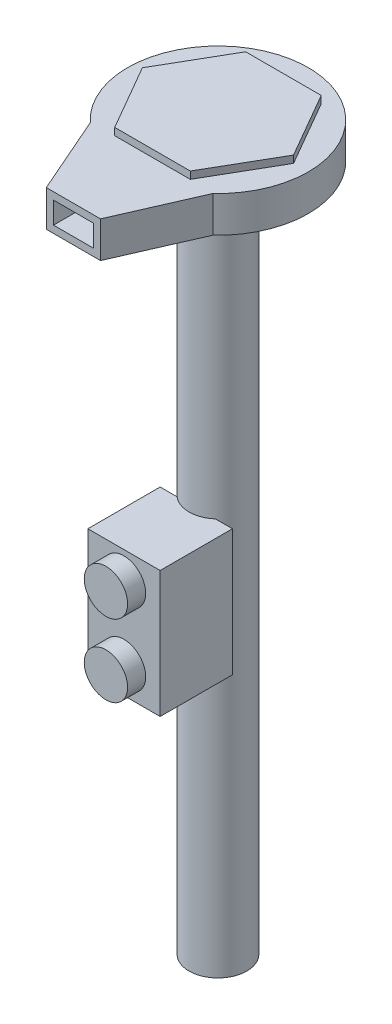
ISO-10303-21;
HEADER;
FILE_DESCRIPTION(('STEP AP214'),'2;1');
FILE_NAME('part.step','',(''),(''),'','','');
FILE_SCHEMA(('AUTOMOTIVE_DESIGN { 1 0 10303 214 1 1 1 1 }'));
ENDSEC;
DATA;
#1=APPLICATION_CONTEXT('core data for automotive mechanical design processes');
#2=APPLICATION_PROTOCOL_DEFINITION('international standard','automotive_design',2000,#1);
#3=PRODUCT_CONTEXT('',#1,'mechanical');
#4=PRODUCT('Part','Part','',(#3));
#5=PRODUCT_RELATED_PRODUCT_CATEGORY('part','',(#4));
#6=PRODUCT_DEFINITION_FORMATION('','',#4);
#7=PRODUCT_DEFINITION_CONTEXT('part definition',#1,'design');
#8=PRODUCT_DEFINITION('design','',#6,#7);
#9=PRODUCT_DEFINITION_SHAPE('','',#8);
#10=(LENGTH_UNIT() NAMED_UNIT(*) SI_UNIT(.MILLI.,.METRE.));
#11=(NAMED_UNIT(*) PLANE_ANGLE_UNIT() SI_UNIT($,.RADIAN.));
#12=(NAMED_UNIT(*) SI_UNIT($,.STERADIAN.) SOLID_ANGLE_UNIT());
#13=UNCERTAINTY_MEASURE_WITH_UNIT(LENGTH_MEASURE(1.E-05),#10,'distance_accuracy_value','');
#14=(GEOMETRIC_REPRESENTATION_CONTEXT(3) GLOBAL_UNCERTAINTY_ASSIGNED_CONTEXT((#13)) GLOBAL_UNIT_ASSIGNED_CONTEXT((#10,
#11,#12)) REPRESENTATION_CONTEXT('',''));
#15=CARTESIAN_POINT('',(0.,0.,0.));
#16=DIRECTION('',(0.,0.,1.));
#17=DIRECTION('',(1.,0.,0.));
#18=AXIS2_PLACEMENT_3D('',#15,#16,#17);
#19=CARTESIAN_POINT('',(-2.75000000000001,99.,-2.5));
#20=DIRECTION('',(-1.,0.,0.));
#21=DIRECTION('',(0.,-1.,0.));
#22=AXIS2_PLACEMENT_3D('',#19,#20,#21);
#23=PLANE('',#22);
#24=DIRECTION('',(0.,0.,1.));
#25=VECTOR('',#24,1.);
#26=CARTESIAN_POINT('',(-2.75000000000001,96.,-2.5));
#27=LINE('',#26,#25);
#28=CARTESIAN_POINT('',(-2.75000000000001,96.,1.19895788082816));
#29=VERTEX_POINT('',#28);
#30=CARTESIAN_POINT('',(-2.75000000000001,96.,20.));
#31=VERTEX_POINT('',#30);
#32=EDGE_CURVE('E413',#29,#31,#27,.T.);
#33=ORIENTED_EDGE('',*,*,#32,.F.);
#34=DIRECTION('',(0.,1.,0.));
#35=VECTOR('',#34,1.);
#36=CARTESIAN_POINT('',(-2.75,0.,1.19895788082819));
#37=LINE('',#36,#35);
#38=CARTESIAN_POINT('',(-2.75000000000001,99.,1.19895788082815));
#39=VERTEX_POINT('',#38);
#40=EDGE_CURVE('E389',#29,#39,#37,.T.);
#41=ORIENTED_EDGE('',*,*,#40,.T.);
#42=DIRECTION('',(0.,0.,1.));
#43=VECTOR('',#42,1.);
#44=CARTESIAN_POINT('',(-2.75000000000001,99.,-2.5));
#45=LINE('',#44,#43);
#46=CARTESIAN_POINT('',(-2.75000000000001,99.,20.));
#47=VERTEX_POINT('',#46);
#48=EDGE_CURVE('E433',#39,#47,#45,.T.);
#49=ORIENTED_EDGE('',*,*,#48,.T.);
#50=DIRECTION('',(0.,-1.,0.));
#51=VECTOR('',#50,1.);
#52=CARTESIAN_POINT('',(-2.75000000000001,99.,20.));
#53=LINE('',#52,#51);
#54=EDGE_CURVE('E393',#47,#31,#53,.T.);
#55=ORIENTED_EDGE('',*,*,#54,.T.);
#56=EDGE_LOOP('',(#33,#41,#49,#55));
#57=FACE_BOUND('',#56,.T.);
#58=ADVANCED_FACE('F49',(#57),#23,.F.);
#59=CARTESIAN_POINT('',(-2.75000000000001,96.,-2.5));
#60=DIRECTION('',(0.,-1.,0.));
#61=DIRECTION('',(0.,0.,-1.));
#62=AXIS2_PLACEMENT_3D('',#59,#60,#61);
#63=PLANE('',#62);
#64=DIRECTION('',(0.,0.,1.));
#65=VECTOR('',#64,1.);
#66=CARTESIAN_POINT('',(2.74999999999999,96.,-2.5));
#67=LINE('',#66,#65);
#68=CARTESIAN_POINT('',(2.74999999999999,96.,1.19895788082821));
#69=VERTEX_POINT('',#68);
#70=CARTESIAN_POINT('',(2.74999999999999,96.,20.));
#71=VERTEX_POINT('',#70);
#72=EDGE_CURVE('E443',#69,#71,#67,.T.);
#73=ORIENTED_EDGE('',*,*,#72,.F.);
#74=CARTESIAN_POINT('',(0.,96.,0.));
#75=DIRECTION('',(0.,-1.,0.));
#76=DIRECTION('',(0.,0.,-1.));
#77=AXIS2_PLACEMENT_3D('',#74,#75,#76);
#78=CIRCLE('',#77,3.);
#79=EDGE_CURVE('E370',#69,#29,#78,.T.);
#80=ORIENTED_EDGE('',*,*,#79,.T.);
#81=ORIENTED_EDGE('',*,*,#32,.T.);
#82=DIRECTION('',(1.,0.,0.));
#83=VECTOR('',#82,1.);
#84=CARTESIAN_POINT('',(-2.75000000000001,96.,20.));
#85=LINE('',#84,#83);
#86=EDGE_CURVE('E417',#31,#71,#85,.T.);
#87=ORIENTED_EDGE('',*,*,#86,.T.);
#88=EDGE_LOOP('',(#73,#80,#81,#87));
#89=FACE_BOUND('',#88,.T.);
#90=ADVANCED_FACE('F588',(#89),#63,.F.);
#91=CARTESIAN_POINT('',(0.,95.,0.));
#92=DIRECTION('',(0.,1.,0.));
#93=DIRECTION('',(0.,0.,1.));
#94=AXIS2_PLACEMENT_3D('',#91,#92,#93);
#95=CYLINDRICAL_SURFACE('',#94,12.5);
#96=CARTESIAN_POINT('',(0.,100.,0.));
#97=DIRECTION('',(0.,1.,0.));
#98=DIRECTION('',(0.,0.,1.));
#99=AXIS2_PLACEMENT_3D('',#96,#97,#98);
#100=CIRCLE('',#99,12.5);
#101=CARTESIAN_POINT('',(8.48360655737704,100.,9.18032786885246));
#102=VERTEX_POINT('',#101);
#103=CARTESIAN_POINT('',(-8.48360655737706,100.,9.18032786885245));
#104=VERTEX_POINT('',#103);
#105=EDGE_CURVE('E645',#102,#104,#100,.T.);
#106=ORIENTED_EDGE('',*,*,#105,.F.);
#107=DIRECTION('',(0.,1.,0.));
#108=VECTOR('',#107,1.);
#109=CARTESIAN_POINT('',(8.48360655737705,95.,9.18032786885246));
#110=LINE('',#109,#108);
#111=CARTESIAN_POINT('',(8.48360655737705,95.,9.18032786885246));
#112=VERTEX_POINT('',#111);
#113=EDGE_CURVE('E467',#102,#112,#110,.F.);
#114=ORIENTED_EDGE('',*,*,#113,.T.);
#115=CARTESIAN_POINT('',(0.,95.,0.));
#116=DIRECTION('',(0.,1.,0.));
#117=DIRECTION('',(0.,0.,1.));
#118=AXIS2_PLACEMENT_3D('',#115,#116,#117);
#119=CIRCLE('',#118,12.5);
#120=CARTESIAN_POINT('',(-8.48360655737706,95.,9.18032786885245));
#121=VERTEX_POINT('',#120);
#122=EDGE_CURVE('E635',#112,#121,#119,.T.);
#123=ORIENTED_EDGE('',*,*,#122,.T.);
#124=DIRECTION('',(0.,1.,0.));
#125=VECTOR('',#124,1.);
#126=CARTESIAN_POINT('',(-8.48360655737705,95.,9.18032786885245));
#127=LINE('',#126,#125);
#128=EDGE_CURVE('E649',#121,#104,#127,.T.);
#129=ORIENTED_EDGE('',*,*,#128,.T.);
#130=EDGE_LOOP('',(#106,#114,#123,#129));
#131=FACE_BOUND('',#130,.T.);
#132=ADVANCED_FACE('F593',(#131),#95,.T.);
#133=CARTESIAN_POINT('',(0.,100.,0.));
#134=DIRECTION('',(0.,-1.,0.));
#135=DIRECTION('',(0.,0.,-1.));
#136=AXIS2_PLACEMENT_3D('',#133,#134,#135);
#137=CYLINDRICAL_SURFACE('',#136,4.);
#138=CARTESIAN_POINT('',(0.,55.,0.));
#139=DIRECTION('',(0.,1.,0.));
#140=DIRECTION('',(0.,0.,1.));
#141=AXIS2_PLACEMENT_3D('',#138,#139,#140);
#142=CIRCLE('',#141,4.);
#143=CARTESIAN_POINT('',(-2.64575131106459,55.,3.));
#144=VERTEX_POINT('',#143);
#145=CARTESIAN_POINT('',(2.64575131106459,55.,3.));
#146=VERTEX_POINT('',#145);
#147=EDGE_CURVE('E293',#144,#146,#142,.T.);
#148=ORIENTED_EDGE('',*,*,#147,.T.);
#149=DIRECTION('',(0.,-1.,0.));
#150=VECTOR('',#149,1.);
#151=CARTESIAN_POINT('',(2.64575131106459,100.,3.));
#152=LINE('',#151,#150);
#153=CARTESIAN_POINT('',(2.64575131106459,37.5,3.));
#154=VERTEX_POINT('',#153);
#155=EDGE_CURVE('E286',#146,#154,#152,.T.);
#156=ORIENTED_EDGE('',*,*,#155,.T.);
#157=CARTESIAN_POINT('',(0.,37.5,0.));
#158=DIRECTION('',(0.,1.,0.));
#159=DIRECTION('',(0.,0.,1.));
#160=AXIS2_PLACEMENT_3D('',#157,#158,#159);
#161=CIRCLE('',#160,4.);
#162=CARTESIAN_POINT('',(-2.64575131106459,37.5,3.));
#163=VERTEX_POINT('',#162);
#164=EDGE_CURVE('E290',#163,#154,#161,.T.);
#165=ORIENTED_EDGE('',*,*,#164,.F.);
#166=DIRECTION('',(0.,-1.,0.));
#167=VECTOR('',#166,1.);
#168=CARTESIAN_POINT('',(-2.64575131106459,100.,3.));
#169=LINE('',#168,#167);
#170=EDGE_CURVE('E276',#163,#144,#169,.F.);
#171=ORIENTED_EDGE('',*,*,#170,.T.);
#172=EDGE_LOOP('',(#148,#156,#165,#171));
#173=FACE_BOUND('',#172,.T.);
#174=CARTESIAN_POINT('',(0.,0.,0.));
#175=DIRECTION('',(0.,1.,0.));
#176=DIRECTION('',(0.,0.,1.));
#177=AXIS2_PLACEMENT_3D('',#174,#175,#176);
#178=CIRCLE('',#177,4.);
#179=CARTESIAN_POINT('',(0.,0.,4.));
#180=VERTEX_POINT('',#179);
#181=EDGE_CURVE('E627',#180,#180,#178,.T.);
#182=ORIENTED_EDGE('',*,*,#181,.T.);
#183=EDGE_LOOP('',(#182));
#184=FACE_BOUND('',#183,.T.);
#185=CARTESIAN_POINT('',(0.,95.,0.));
#186=DIRECTION('',(0.,1.,0.));
#187=DIRECTION('',(0.,0.,1.));
#188=AXIS2_PLACEMENT_3D('',#185,#186,#187);
#189=CIRCLE('',#188,4.);
#190=CARTESIAN_POINT('',(0.,95.,4.));
#191=VERTEX_POINT('',#190);
#192=EDGE_CURVE('E623',#191,#191,#189,.T.);
#193=ORIENTED_EDGE('',*,*,#192,.F.);
#194=EDGE_LOOP('',(#193));
#195=FACE_BOUND('',#194,.T.);
#196=ADVANCED_FACE('F51',(#173,#184,#195),#137,.T.);
#197=CARTESIAN_POINT('',(0.,0.,0.));
#198=DIRECTION('',(0.,1.,0.));
#199=DIRECTION('',(0.,0.,1.));
#200=AXIS2_PLACEMENT_3D('',#197,#198,#199);
#201=CYLINDRICAL_SURFACE('',#200,3.);
#202=CARTESIAN_POINT('',(0.,0.,0.));
#203=DIRECTION('',(0.,1.,0.));
#204=DIRECTION('',(0.,0.,1.));
#205=AXIS2_PLACEMENT_3D('',#202,#203,#204);
#206=CIRCLE('',#205,3.);
#207=CARTESIAN_POINT('',(0.,0.,3.));
#208=VERTEX_POINT('',#207);
#209=EDGE_CURVE('E632',#208,#208,#206,.T.);
#210=ORIENTED_EDGE('',*,*,#209,.F.);
#211=EDGE_LOOP('',(#210));
#212=FACE_BOUND('',#211,.T.);
#213=ORIENTED_EDGE('',*,*,#79,.F.);
#214=DIRECTION('',(0.,1.,0.));
#215=VECTOR('',#214,1.);
#216=CARTESIAN_POINT('',(2.75,0.,1.19895788082818));
#217=LINE('',#216,#215);
#218=CARTESIAN_POINT('',(2.75,99.,1.19895788082818));
#219=VERTEX_POINT('',#218);
#220=EDGE_CURVE('E385',#219,#69,#217,.F.);
#221=ORIENTED_EDGE('',*,*,#220,.F.);
#222=CARTESIAN_POINT('',(0.,99.,0.));
#223=DIRECTION('',(0.,1.,0.));
#224=DIRECTION('',(0.,0.,1.));
#225=AXIS2_PLACEMENT_3D('',#222,#223,#224);
#226=CIRCLE('',#225,3.);
#227=EDGE_CURVE('E376',#39,#219,#226,.T.);
#228=ORIENTED_EDGE('',*,*,#227,.F.);
#229=ORIENTED_EDGE('',*,*,#40,.F.);
#230=EDGE_LOOP('',(#213,#221,#228,#229));
#231=FACE_BOUND('',#230,.T.);
#232=DIRECTION('',(0.,1.,0.));
#233=VECTOR('',#232,1.);
#234=CARTESIAN_POINT('',(2.75,0.,-1.19895788082818));
#235=LINE('',#234,#233);
#236=CARTESIAN_POINT('',(2.74999999999999,96.,-1.19895788082821));
#237=VERTEX_POINT('',#236);
#238=CARTESIAN_POINT('',(2.75,99.,-1.19895788082818));
#239=VERTEX_POINT('',#238);
#240=EDGE_CURVE('E381',#237,#239,#235,.T.);
#241=ORIENTED_EDGE('',*,*,#240,.F.);
#242=CARTESIAN_POINT('',(1.6583123951777,96.,-2.5));
#243=VERTEX_POINT('',#242);
#244=EDGE_CURVE('E371',#243,#237,#78,.T.);
#245=ORIENTED_EDGE('',*,*,#244,.F.);
#246=DIRECTION('',(0.,1.,0.));
#247=VECTOR('',#246,1.);
#248=CARTESIAN_POINT('',(1.6583123951777,0.,-2.5));
#249=LINE('',#248,#247);
#250=CARTESIAN_POINT('',(1.6583123951777,99.,-2.5));
#251=VERTEX_POINT('',#250);
#252=EDGE_CURVE('E622',#243,#251,#249,.T.);
#253=ORIENTED_EDGE('',*,*,#252,.T.);
#254=EDGE_CURVE('E377',#239,#251,#226,.T.);
#255=ORIENTED_EDGE('',*,*,#254,.F.);
#256=EDGE_LOOP('',(#241,#245,#253,#255));
#257=FACE_BOUND('',#256,.T.);
#258=CARTESIAN_POINT('',(-1.6583123951777,99.,-2.5));
#259=VERTEX_POINT('',#258);
#260=CARTESIAN_POINT('',(-2.75000000000001,99.,-1.19895788082815));
#261=VERTEX_POINT('',#260);
#262=EDGE_CURVE('E369',#259,#261,#226,.T.);
#263=ORIENTED_EDGE('',*,*,#262,.F.);
#264=DIRECTION('',(0.,1.,0.));
#265=VECTOR('',#264,1.);
#266=CARTESIAN_POINT('',(-1.6583123951777,0.,-2.5));
#267=LINE('',#266,#265);
#268=CARTESIAN_POINT('',(-1.6583123951777,96.,-2.5));
#269=VERTEX_POINT('',#268);
#270=EDGE_CURVE('E562',#259,#269,#267,.F.);
#271=ORIENTED_EDGE('',*,*,#270,.T.);
#272=CARTESIAN_POINT('',(-2.75000000000001,96.,-1.19895788082816));
#273=VERTEX_POINT('',#272);
#274=EDGE_CURVE('E365',#273,#269,#78,.T.);
#275=ORIENTED_EDGE('',*,*,#274,.F.);
#276=DIRECTION('',(0.,1.,0.));
#277=VECTOR('',#276,1.);
#278=CARTESIAN_POINT('',(-2.75,0.,-1.19895788082819));
#279=LINE('',#278,#277);
#280=EDGE_CURVE('E375',#261,#273,#279,.F.);
#281=ORIENTED_EDGE('',*,*,#280,.F.);
#282=EDGE_LOOP('',(#263,#271,#275,#281));
#283=FACE_BOUND('',#282,.T.);
#284=CARTESIAN_POINT('',(0.,100.,0.));
#285=DIRECTION('',(0.,1.,0.));
#286=DIRECTION('',(0.,0.,1.));
#287=AXIS2_PLACEMENT_3D('',#284,#285,#286);
#288=CIRCLE('',#287,3.);
#289=CARTESIAN_POINT('',(0.,100.,3.));
#290=VERTEX_POINT('',#289);
#291=EDGE_CURVE('E361',#290,#290,#288,.T.);
#292=ORIENTED_EDGE('',*,*,#291,.T.);
#293=EDGE_LOOP('',(#292));
#294=FACE_BOUND('',#293,.T.);
#295=ADVANCED_FACE('F573',(#212,#231,#257,#283,#294),#201,.F.);
#296=CARTESIAN_POINT('',(0.,0.,0.));
#297=DIRECTION('',(0.,1.,0.));
#298=DIRECTION('',(0.,0.,1.));
#299=AXIS2_PLACEMENT_3D('',#296,#297,#298);
#300=PLANE('',#299);
#301=ORIENTED_EDGE('',*,*,#209,.T.);
#302=EDGE_LOOP('',(#301));
#303=FACE_BOUND('',#302,.T.);
#304=ORIENTED_EDGE('',*,*,#181,.F.);
#305=EDGE_LOOP('',(#304));
#306=FACE_BOUND('',#305,.T.);
#307=ADVANCED_FACE('F575',(#303,#306),#300,.F.);
#308=CARTESIAN_POINT('',(0.,95.,0.));
#309=DIRECTION('',(0.,1.,0.));
#310=DIRECTION('',(0.,0.,1.));
#311=AXIS2_PLACEMENT_3D('',#308,#309,#310);
#312=PLANE('',#311);
#313=ORIENTED_EDGE('',*,*,#192,.T.);
#314=EDGE_LOOP('',(#313));
#315=FACE_BOUND('',#314,.T.);
#316=DIRECTION('',(0.400818834019707,0.,0.916157334902189));
#317=VECTOR('',#316,1.);
#318=CARTESIAN_POINT('',(-12.5,95.,0.));
#319=LINE('',#318,#317);
#320=CARTESIAN_POINT('',(-3.75000000000001,95.,20.));
#321=VERTEX_POINT('',#320);
#322=EDGE_CURVE('E432',#121,#321,#319,.T.);
#323=ORIENTED_EDGE('',*,*,#322,.F.);
#324=ORIENTED_EDGE('',*,*,#122,.F.);
#325=DIRECTION('',(-0.400818834019708,0.,0.916157334902189));
#326=VECTOR('',#325,1.);
#327=CARTESIAN_POINT('',(12.5,95.,0.));
#328=LINE('',#327,#326);
#329=CARTESIAN_POINT('',(3.74999999999999,95.,20.));
#330=VERTEX_POINT('',#329);
#331=EDGE_CURVE('E458',#112,#330,#328,.T.);
#332=ORIENTED_EDGE('',*,*,#331,.T.);
#333=DIRECTION('',(1.,0.,0.));
#334=VECTOR('',#333,1.);
#335=CARTESIAN_POINT('',(-3.75000000000001,95.,20.));
#336=LINE('',#335,#334);
#337=EDGE_CURVE('E522',#321,#330,#336,.T.);
#338=ORIENTED_EDGE('',*,*,#337,.F.);
#339=EDGE_LOOP('',(#323,#324,#332,#338));
#340=FACE_BOUND('',#339,.T.);
#341=ADVANCED_FACE('F572',(#315,#340),#312,.F.);
#342=CARTESIAN_POINT('',(0.,100.,0.));
#343=DIRECTION('',(0.,1.,0.));
#344=DIRECTION('',(0.,0.,1.));
#345=AXIS2_PLACEMENT_3D('',#342,#343,#344);
#346=PLANE('',#345);
#347=DIRECTION('',(0.499999999999995,0.,-0.866025403784441));
#348=VECTOR('',#347,1.);
#349=CARTESIAN_POINT('',(5.22826930950488,100.,9.05562807971525));
#350=LINE('',#349,#348);
#351=CARTESIAN_POINT('',(5.22826930950488,100.,9.05562807971525));
#352=VERTEX_POINT('',#351);
#353=CARTESIAN_POINT('',(10.4565386190095,100.,0.));
#354=VERTEX_POINT('',#353);
#355=EDGE_CURVE('E73',#352,#354,#350,.T.);
#356=ORIENTED_EDGE('',*,*,#355,.F.);
#357=DIRECTION('',(1.,0.,0.));
#358=VECTOR('',#357,1.);
#359=CARTESIAN_POINT('',(-5.22826930950469,100.,9.05562807971536));
#360=LINE('',#359,#358);
#361=CARTESIAN_POINT('',(-5.22826930950469,100.,9.05562807971536));
#362=VERTEX_POINT('',#361);
#363=EDGE_CURVE('E302',#362,#352,#360,.T.);
#364=ORIENTED_EDGE('',*,*,#363,.F.);
#365=DIRECTION('',(0.500000000000007,0.,0.866025403784435));
#366=VECTOR('',#365,1.);
#367=CARTESIAN_POINT('',(-10.4565386190095,100.,0.));
#368=LINE('',#367,#366);
#369=CARTESIAN_POINT('',(-10.4565386190095,100.,0.));
#370=VERTEX_POINT('',#369);
#371=EDGE_CURVE('E332',#370,#362,#368,.T.);
#372=ORIENTED_EDGE('',*,*,#371,.F.);
#373=DIRECTION('',(-0.499999999999995,0.,0.866025403784442));
#374=VECTOR('',#373,1.);
#375=CARTESIAN_POINT('',(-5.22826930950481,100.,-9.05562807971529));
#376=LINE('',#375,#374);
#377=CARTESIAN_POINT('',(-5.22826930950481,100.,-9.05562807971529));
#378=VERTEX_POINT('',#377);
#379=EDGE_CURVE('E328',#378,#370,#376,.T.);
#380=ORIENTED_EDGE('',*,*,#379,.F.);
#381=DIRECTION('',(-1.,0.,0.));
#382=VECTOR('',#381,1.);
#383=CARTESIAN_POINT('',(5.22826930950475,100.,-9.05562807971532));
#384=LINE('',#383,#382);
#385=CARTESIAN_POINT('',(5.22826930950475,100.,-9.05562807971532));
#386=VERTEX_POINT('',#385);
#387=EDGE_CURVE('E324',#386,#378,#384,.T.);
#388=ORIENTED_EDGE('',*,*,#387,.F.);
#389=DIRECTION('',(-0.500000000000001,0.,-0.866025403784438));
#390=VECTOR('',#389,1.);
#391=CARTESIAN_POINT('',(10.4565386190095,100.,0.));
#392=LINE('',#391,#390);
#393=EDGE_CURVE('E320',#354,#386,#392,.T.);
#394=ORIENTED_EDGE('',*,*,#393,.F.);
#395=EDGE_LOOP('',(#356,#364,#372,#380,#388,#394));
#396=FACE_BOUND('',#395,.T.);
#397=ORIENTED_EDGE('',*,*,#105,.T.);
#398=DIRECTION('',(0.400818834019707,0.,0.916157334902189));
#399=VECTOR('',#398,1.);
#400=CARTESIAN_POINT('',(-12.5,100.,0.));
#401=LINE('',#400,#399);
#402=CARTESIAN_POINT('',(-3.75000000000001,100.,20.));
#403=VERTEX_POINT('',#402);
#404=EDGE_CURVE('E466',#104,#403,#401,.T.);
#405=ORIENTED_EDGE('',*,*,#404,.T.);
#406=DIRECTION('',(-1.,0.,0.));
#407=VECTOR('',#406,1.);
#408=CARTESIAN_POINT('',(-3.75000000000001,100.,20.));
#409=LINE('',#408,#407);
#410=CARTESIAN_POINT('',(3.74999999999999,100.,20.));
#411=VERTEX_POINT('',#410);
#412=EDGE_CURVE('E521',#411,#403,#409,.T.);
#413=ORIENTED_EDGE('',*,*,#412,.F.);
#414=DIRECTION('',(-0.400818834019708,0.,0.916157334902189));
#415=VECTOR('',#414,1.);
#416=CARTESIAN_POINT('',(12.5,100.,0.));
#417=LINE('',#416,#415);
#418=EDGE_CURVE('E453',#102,#411,#417,.T.);
#419=ORIENTED_EDGE('',*,*,#418,.F.);
#420=EDGE_LOOP('',(#397,#405,#413,#419));
#421=FACE_BOUND('',#420,.T.);
#422=ADVANCED_FACE('F552',(#396,#421),#346,.T.);
#423=CARTESIAN_POINT('',(0.,0.,20.));
#424=DIRECTION('',(0.,0.,1.));
#425=DIRECTION('',(1.,0.,0.));
#426=AXIS2_PLACEMENT_3D('',#423,#424,#425);
#427=PLANE('',#426);
#428=ORIENTED_EDGE('',*,*,#54,.F.);
#429=DIRECTION('',(-1.,0.,0.));
#430=VECTOR('',#429,1.);
#431=CARTESIAN_POINT('',(-2.75000000000001,99.,20.));
#432=LINE('',#431,#430);
#433=CARTESIAN_POINT('',(2.74999999999999,99.,20.));
#434=VERTEX_POINT('',#433);
#435=EDGE_CURVE('E399',#434,#47,#432,.T.);
#436=ORIENTED_EDGE('',*,*,#435,.F.);
#437=DIRECTION('',(0.,1.,0.));
#438=VECTOR('',#437,1.);
#439=CARTESIAN_POINT('',(2.74999999999999,99.,20.));
#440=LINE('',#439,#438);
#441=EDGE_CURVE('E421',#71,#434,#440,.T.);
#442=ORIENTED_EDGE('',*,*,#441,.F.);
#443=ORIENTED_EDGE('',*,*,#86,.F.);
#444=EDGE_LOOP('',(#428,#436,#442,#443));
#445=FACE_BOUND('',#444,.T.);
#446=DIRECTION('',(0.,-1.,0.));
#447=VECTOR('',#446,1.);
#448=CARTESIAN_POINT('',(-3.75000000000001,100.,20.));
#449=LINE('',#448,#447);
#450=EDGE_CURVE('E457',#403,#321,#449,.T.);
#451=ORIENTED_EDGE('',*,*,#450,.T.);
#452=ORIENTED_EDGE('',*,*,#337,.T.);
#453=DIRECTION('',(0.,1.,0.));
#454=VECTOR('',#453,1.);
#455=CARTESIAN_POINT('',(3.74999999999999,100.,20.));
#456=LINE('',#455,#454);
#457=EDGE_CURVE('E516',#330,#411,#456,.T.);
#458=ORIENTED_EDGE('',*,*,#457,.T.);
#459=ORIENTED_EDGE('',*,*,#412,.T.);
#460=EDGE_LOOP('',(#451,#452,#458,#459));
#461=FACE_BOUND('',#460,.T.);
#462=ADVANCED_FACE('F494',(#445,#461),#427,.T.);
#463=CARTESIAN_POINT('',(-10.4918032786885,0.,4.59016393442622));
#464=DIRECTION('',(0.916157334902189,0.,-0.400818834019707));
#465=DIRECTION('',(-0.400818834019707,0.,-0.916157334902189));
#466=AXIS2_PLACEMENT_3D('',#463,#464,#465);
#467=PLANE('',#466);
#468=ORIENTED_EDGE('',*,*,#128,.F.);
#469=ORIENTED_EDGE('',*,*,#322,.T.);
#470=ORIENTED_EDGE('',*,*,#450,.F.);
#471=ORIENTED_EDGE('',*,*,#404,.F.);
#472=EDGE_LOOP('',(#468,#469,#470,#471));
#473=FACE_BOUND('',#472,.T.);
#474=ADVANCED_FACE('F483',(#473),#467,.F.);
#475=CARTESIAN_POINT('',(10.4918032786885,0.,4.59016393442624));
#476=DIRECTION('',(-0.916157334902189,0.,-0.400818834019708));
#477=DIRECTION('',(-0.400818834019708,0.,0.916157334902189));
#478=AXIS2_PLACEMENT_3D('',#475,#476,#477);
#479=PLANE('',#478);
#480=ORIENTED_EDGE('',*,*,#113,.F.);
#481=ORIENTED_EDGE('',*,*,#418,.T.);
#482=ORIENTED_EDGE('',*,*,#457,.F.);
#483=ORIENTED_EDGE('',*,*,#331,.F.);
#484=EDGE_LOOP('',(#480,#481,#482,#483));
#485=FACE_BOUND('',#484,.T.);
#486=ADVANCED_FACE('F493',(#485),#479,.F.);
#487=CARTESIAN_POINT('',(-2.75000000000001,99.,-2.5));
#488=DIRECTION('',(0.,1.,0.));
#489=DIRECTION('',(0.,0.,1.));
#490=AXIS2_PLACEMENT_3D('',#487,#488,#489);
#491=PLANE('',#490);
#492=ORIENTED_EDGE('',*,*,#48,.F.);
#493=ORIENTED_EDGE('',*,*,#227,.T.);
#494=DIRECTION('',(0.,0.,1.));
#495=VECTOR('',#494,1.);
#496=CARTESIAN_POINT('',(2.74999999999999,99.,-2.5));
#497=LINE('',#496,#495);
#498=EDGE_CURVE('E438',#219,#434,#497,.T.);
#499=ORIENTED_EDGE('',*,*,#498,.T.);
#500=ORIENTED_EDGE('',*,*,#435,.T.);
#501=EDGE_LOOP('',(#492,#493,#499,#500));
#502=FACE_BOUND('',#501,.T.);
#503=ADVANCED_FACE('F499',(#502),#491,.F.);
#504=CARTESIAN_POINT('',(2.74999999999999,99.,-2.5));
#505=DIRECTION('',(1.,0.,0.));
#506=DIRECTION('',(0.,1.,0.));
#507=AXIS2_PLACEMENT_3D('',#504,#505,#506);
#508=PLANE('',#507);
#509=ORIENTED_EDGE('',*,*,#498,.F.);
#510=ORIENTED_EDGE('',*,*,#220,.T.);
#511=ORIENTED_EDGE('',*,*,#72,.T.);
#512=ORIENTED_EDGE('',*,*,#441,.T.);
#513=EDGE_LOOP('',(#509,#510,#511,#512));
#514=FACE_BOUND('',#513,.T.);
#515=ADVANCED_FACE('F755',(#514),#508,.F.);
#516=CARTESIAN_POINT('',(0.,0.,-2.5));
#517=DIRECTION('',(0.,0.,1.));
#518=DIRECTION('',(1.,0.,0.));
#519=AXIS2_PLACEMENT_3D('',#516,#517,#518);
#520=PLANE('',#519);
#521=ORIENTED_EDGE('',*,*,#252,.F.);
#522=DIRECTION('',(1.,0.,0.));
#523=VECTOR('',#522,1.);
#524=CARTESIAN_POINT('',(-2.75000000000001,96.,-2.5));
#525=LINE('',#524,#523);
#526=CARTESIAN_POINT('',(2.74999999999999,96.,-2.5));
#527=VERTEX_POINT('',#526);
#528=EDGE_CURVE('E398',#243,#527,#525,.T.);
#529=ORIENTED_EDGE('',*,*,#528,.T.);
#530=DIRECTION('',(0.,1.,0.));
#531=VECTOR('',#530,1.);
#532=CARTESIAN_POINT('',(2.74999999999999,99.,-2.5));
#533=LINE('',#532,#531);
#534=CARTESIAN_POINT('',(2.74999999999999,99.,-2.5));
#535=VERTEX_POINT('',#534);
#536=EDGE_CURVE('E404',#527,#535,#533,.T.);
#537=ORIENTED_EDGE('',*,*,#536,.T.);
#538=DIRECTION('',(-1.,0.,0.));
#539=VECTOR('',#538,1.);
#540=CARTESIAN_POINT('',(-2.75000000000001,99.,-2.5));
#541=LINE('',#540,#539);
#542=EDGE_CURVE('E409',#535,#251,#541,.T.);
#543=ORIENTED_EDGE('',*,*,#542,.T.);
#544=EDGE_LOOP('',(#521,#529,#537,#543));
#545=FACE_BOUND('',#544,.T.);
#546=ADVANCED_FACE('F752',(#545),#520,.T.);
#547=ORIENTED_EDGE('',*,*,#528,.F.);
#548=ORIENTED_EDGE('',*,*,#244,.T.);
#549=EDGE_CURVE('E439',#527,#237,#67,.T.);
#550=ORIENTED_EDGE('',*,*,#549,.F.);
#551=EDGE_LOOP('',(#547,#548,#550));
#552=FACE_BOUND('',#551,.T.);
#553=ADVANCED_FACE('F596',(#552),#63,.F.);
#554=ORIENTED_EDGE('',*,*,#549,.T.);
#555=ORIENTED_EDGE('',*,*,#240,.T.);
#556=EDGE_CURVE('E434',#535,#239,#497,.T.);
#557=ORIENTED_EDGE('',*,*,#556,.F.);
#558=ORIENTED_EDGE('',*,*,#536,.F.);
#559=EDGE_LOOP('',(#554,#555,#557,#558));
#560=FACE_BOUND('',#559,.T.);
#561=ADVANCED_FACE('F759',(#560),#508,.F.);
#562=ORIENTED_EDGE('',*,*,#556,.T.);
#563=ORIENTED_EDGE('',*,*,#254,.T.);
#564=ORIENTED_EDGE('',*,*,#542,.F.);
#565=EDGE_LOOP('',(#562,#563,#564));
#566=FACE_BOUND('',#565,.T.);
#567=ADVANCED_FACE('F611',(#566),#491,.F.);
#568=ORIENTED_EDGE('',*,*,#270,.F.);
#569=CARTESIAN_POINT('',(-2.75000000000001,99.,-2.5));
#570=VERTEX_POINT('',#569);
#571=EDGE_CURVE('E408',#259,#570,#541,.T.);
#572=ORIENTED_EDGE('',*,*,#571,.T.);
#573=DIRECTION('',(0.,-1.,0.));
#574=VECTOR('',#573,1.);
#575=CARTESIAN_POINT('',(-2.75000000000001,99.,-2.5));
#576=LINE('',#575,#574);
#577=CARTESIAN_POINT('',(-2.75000000000001,96.,-2.5));
#578=VERTEX_POINT('',#577);
#579=EDGE_CURVE('E394',#570,#578,#576,.T.);
#580=ORIENTED_EDGE('',*,*,#579,.T.);
#581=EDGE_CURVE('E400',#578,#269,#525,.T.);
#582=ORIENTED_EDGE('',*,*,#581,.T.);
#583=EDGE_LOOP('',(#568,#572,#580,#582));
#584=FACE_BOUND('',#583,.T.);
#585=ADVANCED_FACE('F619',(#584),#520,.T.);
#586=EDGE_CURVE('E444',#578,#273,#27,.T.);
#587=ORIENTED_EDGE('',*,*,#586,.T.);
#588=ORIENTED_EDGE('',*,*,#274,.T.);
#589=ORIENTED_EDGE('',*,*,#581,.F.);
#590=EDGE_LOOP('',(#587,#588,#589));
#591=FACE_BOUND('',#590,.T.);
#592=ADVANCED_FACE('F595',(#591),#63,.F.);
#593=ORIENTED_EDGE('',*,*,#571,.F.);
#594=ORIENTED_EDGE('',*,*,#262,.T.);
#595=EDGE_CURVE('E428',#570,#261,#45,.T.);
#596=ORIENTED_EDGE('',*,*,#595,.F.);
#597=EDGE_LOOP('',(#593,#594,#596));
#598=FACE_BOUND('',#597,.T.);
#599=ADVANCED_FACE('F600',(#598),#491,.F.);
#600=ORIENTED_EDGE('',*,*,#595,.T.);
#601=ORIENTED_EDGE('',*,*,#280,.T.);
#602=ORIENTED_EDGE('',*,*,#586,.F.);
#603=ORIENTED_EDGE('',*,*,#579,.F.);
#604=EDGE_LOOP('',(#600,#601,#602,#603));
#605=FACE_BOUND('',#604,.T.);
#606=ADVANCED_FACE('F495',(#605),#23,.F.);
#607=CARTESIAN_POINT('',(0.,101.,0.));
#608=DIRECTION('',(0.,1.,0.));
#609=DIRECTION('',(0.,0.,1.));
#610=AXIS2_PLACEMENT_3D('',#607,#608,#609);
#611=PLANE('',#610);
#612=DIRECTION('',(0.499999999999995,0.,-0.866025403784441));
#613=VECTOR('',#612,1.);
#614=CARTESIAN_POINT('',(5.22826930950488,101.,9.05562807971525));
#615=LINE('',#614,#613);
#616=CARTESIAN_POINT('',(5.22826930950488,101.,9.05562807971525));
#617=VERTEX_POINT('',#616);
#618=CARTESIAN_POINT('',(10.4565386190095,101.,0.));
#619=VERTEX_POINT('',#618);
#620=EDGE_CURVE('E297',#617,#619,#615,.T.);
#621=ORIENTED_EDGE('',*,*,#620,.T.);
#622=DIRECTION('',(-0.500000000000001,0.,-0.866025403784438));
#623=VECTOR('',#622,1.);
#624=CARTESIAN_POINT('',(10.4565386190095,101.,0.));
#625=LINE('',#624,#623);
#626=CARTESIAN_POINT('',(5.22826930950475,101.,-9.05562807971532));
#627=VERTEX_POINT('',#626);
#628=EDGE_CURVE('E301',#619,#627,#625,.T.);
#629=ORIENTED_EDGE('',*,*,#628,.T.);
#630=DIRECTION('',(-1.,0.,0.));
#631=VECTOR('',#630,1.);
#632=CARTESIAN_POINT('',(5.22826930950475,101.,-9.05562807971532));
#633=LINE('',#632,#631);
#634=CARTESIAN_POINT('',(-5.22826930950481,101.,-9.05562807971529));
#635=VERTEX_POINT('',#634);
#636=EDGE_CURVE('E305',#627,#635,#633,.T.);
#637=ORIENTED_EDGE('',*,*,#636,.T.);
#638=DIRECTION('',(-0.499999999999995,0.,0.866025403784442));
#639=VECTOR('',#638,1.);
#640=CARTESIAN_POINT('',(-5.22826930950481,101.,-9.05562807971529));
#641=LINE('',#640,#639);
#642=CARTESIAN_POINT('',(-10.4565386190095,101.,0.));
#643=VERTEX_POINT('',#642);
#644=EDGE_CURVE('E308',#635,#643,#641,.T.);
#645=ORIENTED_EDGE('',*,*,#644,.T.);
#646=DIRECTION('',(0.500000000000007,0.,0.866025403784435));
#647=VECTOR('',#646,1.);
#648=CARTESIAN_POINT('',(-10.4565386190095,101.,0.));
#649=LINE('',#648,#647);
#650=CARTESIAN_POINT('',(-5.22826930950469,101.,9.05562807971536));
#651=VERTEX_POINT('',#650);
#652=EDGE_CURVE('E311',#643,#651,#649,.T.);
#653=ORIENTED_EDGE('',*,*,#652,.T.);
#654=DIRECTION('',(1.,0.,0.));
#655=VECTOR('',#654,1.);
#656=CARTESIAN_POINT('',(-5.22826930950469,101.,9.05562807971536));
#657=LINE('',#656,#655);
#658=EDGE_CURVE('E314',#651,#617,#657,.T.);
#659=ORIENTED_EDGE('',*,*,#658,.T.);
#660=EDGE_LOOP('',(#621,#629,#637,#645,#653,#659));
#661=FACE_BOUND('',#660,.T.);
#662=ADVANCED_FACE('F599',(#661),#611,.T.);
#663=CARTESIAN_POINT('',(-5.22826930950469,101.,9.05562807971536));
#664=DIRECTION('',(0.,0.,-1.));
#665=DIRECTION('',(-1.,0.,0.));
#666=AXIS2_PLACEMENT_3D('',#663,#664,#665);
#667=PLANE('',#666);
#668=ORIENTED_EDGE('',*,*,#363,.T.);
#669=DIRECTION('',(0.,-1.,0.));
#670=VECTOR('',#669,1.);
#671=CARTESIAN_POINT('',(5.22826930950488,101.,9.05562807971525));
#672=LINE('',#671,#670);
#673=EDGE_CURVE('E317',#617,#352,#672,.T.);
#674=ORIENTED_EDGE('',*,*,#673,.F.);
#675=ORIENTED_EDGE('',*,*,#658,.F.);
#676=DIRECTION('',(0.,-1.,0.));
#677=VECTOR('',#676,1.);
#678=CARTESIAN_POINT('',(-5.22826930950469,101.,9.05562807971536));
#679=LINE('',#678,#677);
#680=EDGE_CURVE('E341',#651,#362,#679,.T.);
#681=ORIENTED_EDGE('',*,*,#680,.T.);
#682=EDGE_LOOP('',(#668,#674,#675,#681));
#683=FACE_BOUND('',#682,.T.);
#684=ADVANCED_FACE('F606',(#683),#667,.F.);
#685=CARTESIAN_POINT('',(-10.4565386190095,101.,0.));
#686=DIRECTION('',(0.866025403784435,0.,-0.500000000000007));
#687=DIRECTION('',(-0.500000000000007,0.,-0.866025403784434));
#688=AXIS2_PLACEMENT_3D('',#685,#686,#687);
#689=PLANE('',#688);
#690=ORIENTED_EDGE('',*,*,#371,.T.);
#691=ORIENTED_EDGE('',*,*,#680,.F.);
#692=ORIENTED_EDGE('',*,*,#652,.F.);
#693=DIRECTION('',(0.,-1.,0.));
#694=VECTOR('',#693,1.);
#695=CARTESIAN_POINT('',(-10.4565386190095,101.,0.));
#696=LINE('',#695,#694);
#697=EDGE_CURVE('E345',#643,#370,#696,.T.);
#698=ORIENTED_EDGE('',*,*,#697,.T.);
#699=EDGE_LOOP('',(#690,#691,#692,#698));
#700=FACE_BOUND('',#699,.T.);
#701=ADVANCED_FACE('F731',(#700),#689,.F.);
#702=CARTESIAN_POINT('',(-5.22826930950481,101.,-9.05562807971529));
#703=DIRECTION('',(0.866025403784442,0.,0.499999999999995));
#704=DIRECTION('',(0.499999999999995,0.,-0.866025403784442));
#705=AXIS2_PLACEMENT_3D('',#702,#703,#704);
#706=PLANE('',#705);
#707=ORIENTED_EDGE('',*,*,#379,.T.);
#708=ORIENTED_EDGE('',*,*,#697,.F.);
#709=ORIENTED_EDGE('',*,*,#644,.F.);
#710=DIRECTION('',(0.,-1.,0.));
#711=VECTOR('',#710,1.);
#712=CARTESIAN_POINT('',(-5.22826930950481,101.,-9.05562807971529));
#713=LINE('',#712,#711);
#714=EDGE_CURVE('E349',#635,#378,#713,.T.);
#715=ORIENTED_EDGE('',*,*,#714,.T.);
#716=EDGE_LOOP('',(#707,#708,#709,#715));
#717=FACE_BOUND('',#716,.T.);
#718=ADVANCED_FACE('F735',(#717),#706,.F.);
#719=CARTESIAN_POINT('',(5.22826930950475,101.,-9.05562807971532));
#720=DIRECTION('',(0.,0.,1.));
#721=DIRECTION('',(1.,0.,0.));
#722=AXIS2_PLACEMENT_3D('',#719,#720,#721);
#723=PLANE('',#722);
#724=ORIENTED_EDGE('',*,*,#387,.T.);
#725=ORIENTED_EDGE('',*,*,#714,.F.);
#726=ORIENTED_EDGE('',*,*,#636,.F.);
#727=DIRECTION('',(0.,-1.,0.));
#728=VECTOR('',#727,1.);
#729=CARTESIAN_POINT('',(5.22826930950475,101.,-9.05562807971532));
#730=LINE('',#729,#728);
#731=EDGE_CURVE('E353',#627,#386,#730,.T.);
#732=ORIENTED_EDGE('',*,*,#731,.T.);
#733=EDGE_LOOP('',(#724,#725,#726,#732));
#734=FACE_BOUND('',#733,.T.);
#735=ADVANCED_FACE('F739',(#734),#723,.F.);
#736=CARTESIAN_POINT('',(10.4565386190095,101.,0.));
#737=DIRECTION('',(-0.866025403784438,0.,0.500000000000001));
#738=DIRECTION('',(0.500000000000001,0.,0.866025403784438));
#739=AXIS2_PLACEMENT_3D('',#736,#737,#738);
#740=PLANE('',#739);
#741=ORIENTED_EDGE('',*,*,#393,.T.);
#742=ORIENTED_EDGE('',*,*,#731,.F.);
#743=ORIENTED_EDGE('',*,*,#628,.F.);
#744=DIRECTION('',(0.,-1.,0.));
#745=VECTOR('',#744,1.);
#746=CARTESIAN_POINT('',(10.4565386190095,101.,0.));
#747=LINE('',#746,#745);
#748=EDGE_CURVE('E357',#619,#354,#747,.T.);
#749=ORIENTED_EDGE('',*,*,#748,.T.);
#750=EDGE_LOOP('',(#741,#742,#743,#749));
#751=FACE_BOUND('',#750,.T.);
#752=ADVANCED_FACE('F743',(#751),#740,.F.);
#753=CARTESIAN_POINT('',(5.22826930950488,101.,9.05562807971525));
#754=DIRECTION('',(-0.866025403784441,0.,-0.499999999999995));
#755=DIRECTION('',(-0.499999999999995,0.,0.866025403784442));
#756=AXIS2_PLACEMENT_3D('',#753,#754,#755);
#757=PLANE('',#756);
#758=ORIENTED_EDGE('',*,*,#355,.T.);
#759=ORIENTED_EDGE('',*,*,#748,.F.);
#760=ORIENTED_EDGE('',*,*,#620,.F.);
#761=ORIENTED_EDGE('',*,*,#673,.T.);
#762=EDGE_LOOP('',(#758,#759,#760,#761));
#763=FACE_BOUND('',#762,.T.);
#764=ADVANCED_FACE('F727',(#763),#757,.F.);
#765=CARTESIAN_POINT('',(0.,100.,0.));
#766=DIRECTION('',(0.,1.,0.));
#767=DIRECTION('',(0.,0.,1.));
#768=AXIS2_PLACEMENT_3D('',#765,#766,#767);
#769=PLANE('',#768);
#770=ORIENTED_EDGE('',*,*,#291,.F.);
#771=EDGE_LOOP('',(#770));
#772=FACE_BOUND('',#771,.T.);
#773=ADVANCED_FACE('F723',(#772),#769,.F.);
#774=CARTESIAN_POINT('',(-5.00000000000001,55.,13.));
#775=DIRECTION('',(0.,1.,0.));
#776=DIRECTION('',(0.,0.,1.));
#777=AXIS2_PLACEMENT_3D('',#774,#775,#776);
#778=PLANE('',#777);
#779=ORIENTED_EDGE('',*,*,#147,.F.);
#780=DIRECTION('',(1.,0.,0.));
#781=VECTOR('',#780,1.);
#782=CARTESIAN_POINT('',(-5.00000000000001,55.,3.));
#783=LINE('',#782,#781);
#784=CARTESIAN_POINT('',(-5.00000000000001,55.,3.));
#785=VERTEX_POINT('',#784);
#786=EDGE_CURVE('E65',#785,#144,#783,.T.);
#787=ORIENTED_EDGE('',*,*,#786,.F.);
#788=DIRECTION('',(0.,0.,-1.));
#789=VECTOR('',#788,1.);
#790=CARTESIAN_POINT('',(-5.00000000000001,55.,13.));
#791=LINE('',#790,#789);
#792=CARTESIAN_POINT('',(-5.00000000000001,55.,13.));
#793=VERTEX_POINT('',#792);
#794=EDGE_CURVE('E249',#793,#785,#791,.T.);
#795=ORIENTED_EDGE('',*,*,#794,.F.);
#796=DIRECTION('',(1.,0.,0.));
#797=VECTOR('',#796,1.);
#798=CARTESIAN_POINT('',(-5.00000000000001,55.,13.));
#799=LINE('',#798,#797);
#800=CARTESIAN_POINT('',(4.99999999999999,55.,13.));
#801=VERTEX_POINT('',#800);
#802=EDGE_CURVE('E242',#793,#801,#799,.T.);
#803=ORIENTED_EDGE('',*,*,#802,.T.);
#804=DIRECTION('',(0.,0.,-1.));
#805=VECTOR('',#804,1.);
#806=CARTESIAN_POINT('',(4.99999999999999,55.,13.));
#807=LINE('',#806,#805);
#808=CARTESIAN_POINT('',(4.99999999999999,55.,3.));
#809=VERTEX_POINT('',#808);
#810=EDGE_CURVE('E225',#801,#809,#807,.T.);
#811=ORIENTED_EDGE('',*,*,#810,.T.);
#812=EDGE_CURVE('E267',#146,#809,#783,.T.);
#813=ORIENTED_EDGE('',*,*,#812,.F.);
#814=EDGE_LOOP('',(#779,#787,#795,#803,#811,#813));
#815=FACE_BOUND('',#814,.T.);
#816=ADVANCED_FACE('F248',(#815),#778,.T.);
#817=CARTESIAN_POINT('',(-5.,37.5,13.));
#818=DIRECTION('',(0.,1.,0.));
#819=DIRECTION('',(0.,0.,1.));
#820=AXIS2_PLACEMENT_3D('',#817,#818,#819);
#821=PLANE('',#820);
#822=DIRECTION('',(1.,0.,0.));
#823=VECTOR('',#822,1.);
#824=CARTESIAN_POINT('',(-5.,37.5,3.));
#825=LINE('',#824,#823);
#826=CARTESIAN_POINT('',(-5.,37.5,3.));
#827=VERTEX_POINT('',#826);
#828=EDGE_CURVE('E255',#827,#163,#825,.T.);
#829=ORIENTED_EDGE('',*,*,#828,.T.);
#830=ORIENTED_EDGE('',*,*,#164,.T.);
#831=CARTESIAN_POINT('',(4.99999999999999,37.5,3.));
#832=VERTEX_POINT('',#831);
#833=EDGE_CURVE('E270',#154,#832,#825,.T.);
#834=ORIENTED_EDGE('',*,*,#833,.T.);
#835=DIRECTION('',(0.,0.,-1.));
#836=VECTOR('',#835,1.);
#837=CARTESIAN_POINT('',(4.99999999999999,37.5,13.));
#838=LINE('',#837,#836);
#839=CARTESIAN_POINT('',(4.99999999999999,37.5,13.));
#840=VERTEX_POINT('',#839);
#841=EDGE_CURVE('E236',#840,#832,#838,.T.);
#842=ORIENTED_EDGE('',*,*,#841,.F.);
#843=DIRECTION('',(1.,0.,0.));
#844=VECTOR('',#843,1.);
#845=CARTESIAN_POINT('',(-5.,37.5,13.));
#846=LINE('',#845,#844);
#847=CARTESIAN_POINT('',(-5.,37.5,13.));
#848=VERTEX_POINT('',#847);
#849=EDGE_CURVE('E244',#848,#840,#846,.T.);
#850=ORIENTED_EDGE('',*,*,#849,.F.);
#851=DIRECTION('',(0.,0.,-1.));
#852=VECTOR('',#851,1.);
#853=CARTESIAN_POINT('',(-5.,37.5,13.));
#854=LINE('',#853,#852);
#855=EDGE_CURVE('E277',#848,#827,#854,.T.);
#856=ORIENTED_EDGE('',*,*,#855,.T.);
#857=EDGE_LOOP('',(#829,#830,#834,#842,#850,#856));
#858=FACE_BOUND('',#857,.T.);
#859=ADVANCED_FACE('F712',(#858),#821,.F.);
#860=CARTESIAN_POINT('',(0.,0.,3.));
#861=DIRECTION('',(0.,0.,-1.));
#862=DIRECTION('',(-1.,0.,0.));
#863=AXIS2_PLACEMENT_3D('',#860,#861,#862);
#864=PLANE('',#863);
#865=ORIENTED_EDGE('',*,*,#155,.F.);
#866=ORIENTED_EDGE('',*,*,#812,.T.);
#867=DIRECTION('',(0.,-1.,0.));
#868=VECTOR('',#867,1.);
#869=CARTESIAN_POINT('',(4.99999999999999,55.,3.));
#870=LINE('',#869,#868);
#871=EDGE_CURVE('E231',#809,#832,#870,.T.);
#872=ORIENTED_EDGE('',*,*,#871,.T.);
#873=ORIENTED_EDGE('',*,*,#833,.F.);
#874=EDGE_LOOP('',(#865,#866,#872,#873));
#875=FACE_BOUND('',#874,.T.);
#876=ADVANCED_FACE('F708',(#875),#864,.T.);
#877=ORIENTED_EDGE('',*,*,#170,.F.);
#878=ORIENTED_EDGE('',*,*,#828,.F.);
#879=DIRECTION('',(0.,-1.,0.));
#880=VECTOR('',#879,1.);
#881=CARTESIAN_POINT('',(-5.00000000000001,55.,3.));
#882=LINE('',#881,#880);
#883=EDGE_CURVE('E252',#785,#827,#882,.T.);
#884=ORIENTED_EDGE('',*,*,#883,.F.);
#885=ORIENTED_EDGE('',*,*,#786,.T.);
#886=EDGE_LOOP('',(#877,#878,#884,#885));
#887=FACE_BOUND('',#886,.T.);
#888=ADVANCED_FACE('F711',(#887),#864,.T.);
#889=CARTESIAN_POINT('',(-5.00000000000001,55.,13.));
#890=DIRECTION('',(1.,0.,0.));
#891=DIRECTION('',(0.,1.,0.));
#892=AXIS2_PLACEMENT_3D('',#889,#890,#891);
#893=PLANE('',#892);
#894=ORIENTED_EDGE('',*,*,#883,.T.);
#895=ORIENTED_EDGE('',*,*,#855,.F.);
#896=DIRECTION('',(0.,-1.,0.));
#897=VECTOR('',#896,1.);
#898=CARTESIAN_POINT('',(-5.00000000000001,55.,13.));
#899=LINE('',#898,#897);
#900=EDGE_CURVE('E237',#793,#848,#899,.T.);
#901=ORIENTED_EDGE('',*,*,#900,.F.);
#902=ORIENTED_EDGE('',*,*,#794,.T.);
#903=EDGE_LOOP('',(#894,#895,#901,#902));
#904=FACE_BOUND('',#903,.T.);
#905=ADVANCED_FACE('F713',(#904),#893,.F.);
#906=CARTESIAN_POINT('',(4.99999999999999,55.,13.));
#907=DIRECTION('',(1.,0.,0.));
#908=DIRECTION('',(0.,1.,0.));
#909=AXIS2_PLACEMENT_3D('',#906,#907,#908);
#910=PLANE('',#909);
#911=ORIENTED_EDGE('',*,*,#871,.F.);
#912=ORIENTED_EDGE('',*,*,#810,.F.);
#913=DIRECTION('',(0.,-1.,0.));
#914=VECTOR('',#913,1.);
#915=CARTESIAN_POINT('',(4.99999999999999,55.,13.));
#916=LINE('',#915,#914);
#917=EDGE_CURVE('E229',#801,#840,#916,.T.);
#918=ORIENTED_EDGE('',*,*,#917,.T.);
#919=ORIENTED_EDGE('',*,*,#841,.T.);
#920=EDGE_LOOP('',(#911,#912,#918,#919));
#921=FACE_BOUND('',#920,.T.);
#922=ADVANCED_FACE('F227',(#921),#910,.T.);
#923=CARTESIAN_POINT('',(0.,0.,13.));
#924=DIRECTION('',(0.,0.,-1.));
#925=DIRECTION('',(-1.,0.,0.));
#926=AXIS2_PLACEMENT_3D('',#923,#924,#925);
#927=PLANE('',#926);
#928=CARTESIAN_POINT('',(0.,41.25,13.));
#929=DIRECTION('',(0.,0.,-1.));
#930=DIRECTION('',(-1.,0.,0.));
#931=AXIS2_PLACEMENT_3D('',#928,#929,#930);
#932=CIRCLE('',#931,3.);
#933=CARTESIAN_POINT('',(-3.,41.25,13.));
#934=VERTEX_POINT('',#933);
#935=EDGE_CURVE('E12',#934,#934,#932,.F.);
#936=ORIENTED_EDGE('',*,*,#935,.F.);
#937=EDGE_LOOP('',(#936));
#938=FACE_BOUND('',#937,.T.);
#939=CARTESIAN_POINT('',(0.,51.25,13.));
#940=DIRECTION('',(0.,0.,-1.));
#941=DIRECTION('',(-1.,0.,0.));
#942=AXIS2_PLACEMENT_3D('',#939,#940,#941);
#943=CIRCLE('',#942,3.);
#944=CARTESIAN_POINT('',(-3.,51.25,13.));
#945=VERTEX_POINT('',#944);
#946=EDGE_CURVE('E58',#945,#945,#943,.F.);
#947=ORIENTED_EDGE('',*,*,#946,.F.);
#948=EDGE_LOOP('',(#947));
#949=FACE_BOUND('',#948,.T.);
#950=ORIENTED_EDGE('',*,*,#802,.F.);
#951=ORIENTED_EDGE('',*,*,#900,.T.);
#952=ORIENTED_EDGE('',*,*,#849,.T.);
#953=ORIENTED_EDGE('',*,*,#917,.F.);
#954=EDGE_LOOP('',(#950,#951,#952,#953));
#955=FACE_BOUND('',#954,.T.);
#956=ADVANCED_FACE('F241',(#938,#949,#955),#927,.F.);
#957=CARTESIAN_POINT('',(0.,51.25,15.5));
#958=DIRECTION('',(0.,0.,-1.));
#959=DIRECTION('',(-1.,0.,0.));
#960=AXIS2_PLACEMENT_3D('',#957,#958,#959);
#961=CYLINDRICAL_SURFACE('',#960,3.);
#962=CARTESIAN_POINT('',(0.,51.25,15.5));
#963=DIRECTION('',(0.,0.,1.));
#964=DIRECTION('',(1.,0.,0.));
#965=AXIS2_PLACEMENT_3D('',#962,#963,#964);
#966=CIRCLE('',#965,3.);
#967=CARTESIAN_POINT('',(3.,51.25,15.5));
#968=VERTEX_POINT('',#967);
#969=EDGE_CURVE('E258',#968,#968,#966,.T.);
#970=ORIENTED_EDGE('',*,*,#969,.F.);
#971=EDGE_LOOP('',(#970));
#972=FACE_BOUND('',#971,.T.);
#973=ORIENTED_EDGE('',*,*,#946,.T.);
#974=EDGE_LOOP('',(#973));
#975=FACE_BOUND('',#974,.T.);
#976=ADVANCED_FACE('F694',(#972,#975),#961,.T.);
#977=CARTESIAN_POINT('',(0.,51.25,15.5));
#978=DIRECTION('',(0.,0.,1.));
#979=DIRECTION('',(1.,0.,0.));
#980=AXIS2_PLACEMENT_3D('',#977,#978,#979);
#981=PLANE('',#980);
#982=ORIENTED_EDGE('',*,*,#969,.T.);
#983=EDGE_LOOP('',(#982));
#984=FACE_BOUND('',#983,.T.);
#985=ADVANCED_FACE('F688',(#984),#981,.T.);
#986=CARTESIAN_POINT('',(0.,41.25,15.5));
#987=DIRECTION('',(0.,0.,-1.));
#988=DIRECTION('',(-1.,0.,0.));
#989=AXIS2_PLACEMENT_3D('',#986,#987,#988);
#990=CYLINDRICAL_SURFACE('',#989,3.);
#991=CARTESIAN_POINT('',(0.,41.25,15.5));
#992=DIRECTION('',(0.,0.,1.));
#993=DIRECTION('',(1.,0.,0.));
#994=AXIS2_PLACEMENT_3D('',#991,#992,#993);
#995=CIRCLE('',#994,3.);
#996=CARTESIAN_POINT('',(3.,41.25,15.5));
#997=VERTEX_POINT('',#996);
#998=EDGE_CURVE('E676',#997,#997,#995,.T.);
#999=ORIENTED_EDGE('',*,*,#998,.F.);
#1000=EDGE_LOOP('',(#999));
#1001=FACE_BOUND('',#1000,.T.);
#1002=ORIENTED_EDGE('',*,*,#935,.T.);
#1003=EDGE_LOOP('',(#1002));
#1004=FACE_BOUND('',#1003,.T.);
#1005=ADVANCED_FACE('F685',(#1001,#1004),#990,.T.);
#1006=CARTESIAN_POINT('',(0.,41.25,15.5));
#1007=DIRECTION('',(0.,0.,1.));
#1008=DIRECTION('',(1.,0.,0.));
#1009=AXIS2_PLACEMENT_3D('',#1006,#1007,#1008);
#1010=PLANE('',#1009);
#1011=ORIENTED_EDGE('',*,*,#998,.T.);
#1012=EDGE_LOOP('',(#1011));
#1013=FACE_BOUND('',#1012,.T.);
#1014=ADVANCED_FACE('F683',(#1013),#1010,.T.);
#1015=CLOSED_SHELL('',(#58,#90,#132,#196,#295,#307,#341,#422,#462,#474,#486,#503,#515,#546,#553,
#561,#567,#585,#592,#599,#606,#662,#684,#701,#718,#735,#752,#764,#773,#816,#859,#876,#888,#905,
#922,#956,#976,#985,#1005,#1014));
#1016=MANIFOLD_SOLID_BREP('B2',#1015);
#1017=ADVANCED_BREP_SHAPE_REPRESENTATION('',(#18,#1016),#14);
#1018=SHAPE_DEFINITION_REPRESENTATION(#9,#1017);
ENDSEC;
END-ISO-10303-21;
